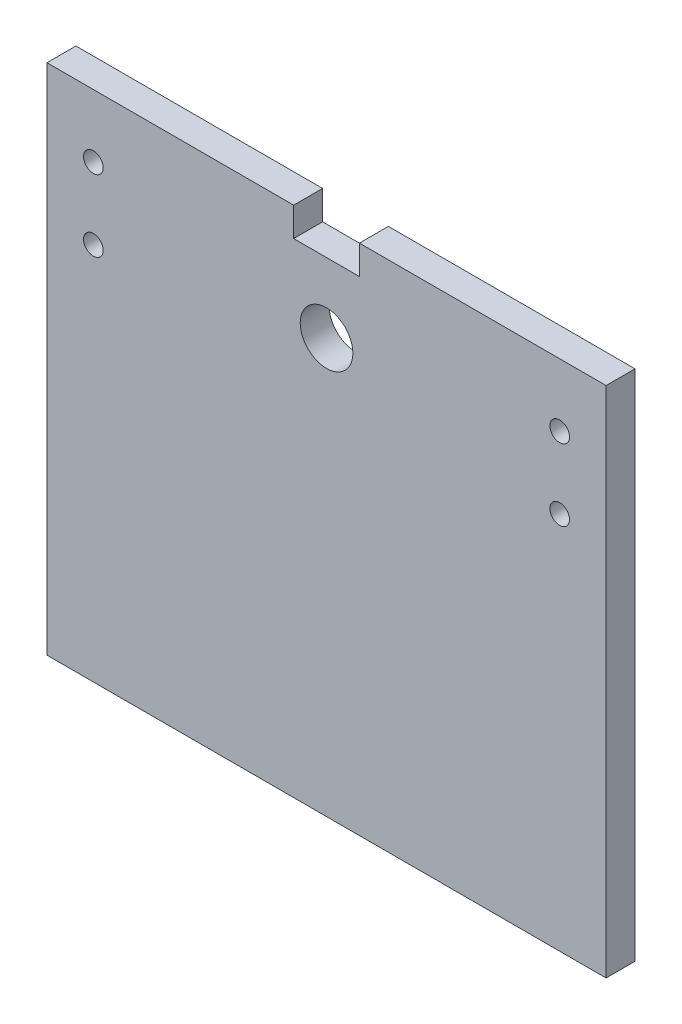
ISO-10303-21;
HEADER;
FILE_DESCRIPTION(('STEP AP214'),'2;1');
FILE_NAME('part.step','',(''),(''),'','','');
FILE_SCHEMA(('AUTOMOTIVE_DESIGN { 1 0 10303 214 1 1 1 1 }'));
ENDSEC;
DATA;
#1=APPLICATION_CONTEXT('core data for automotive mechanical design processes');
#2=APPLICATION_PROTOCOL_DEFINITION('international standard','automotive_design',2000,#1);
#3=PRODUCT_CONTEXT('',#1,'mechanical');
#4=PRODUCT('Part','Part','',(#3));
#5=PRODUCT_RELATED_PRODUCT_CATEGORY('part','',(#4));
#6=PRODUCT_DEFINITION_FORMATION('','',#4);
#7=PRODUCT_DEFINITION_CONTEXT('part definition',#1,'design');
#8=PRODUCT_DEFINITION('design','',#6,#7);
#9=PRODUCT_DEFINITION_SHAPE('','',#8);
#10=(LENGTH_UNIT() NAMED_UNIT(*) SI_UNIT(.MILLI.,.METRE.));
#11=(NAMED_UNIT(*) PLANE_ANGLE_UNIT() SI_UNIT($,.RADIAN.));
#12=(NAMED_UNIT(*) SI_UNIT($,.STERADIAN.) SOLID_ANGLE_UNIT());
#13=UNCERTAINTY_MEASURE_WITH_UNIT(LENGTH_MEASURE(1.E-05),#10,'distance_accuracy_value','');
#14=(GEOMETRIC_REPRESENTATION_CONTEXT(3) GLOBAL_UNCERTAINTY_ASSIGNED_CONTEXT((#13)) GLOBAL_UNIT_ASSIGNED_CONTEXT((#10,
#11,#12)) REPRESENTATION_CONTEXT('',''));
#15=CARTESIAN_POINT('',(0.,0.,0.));
#16=DIRECTION('',(0.,0.,1.));
#17=DIRECTION('',(1.,0.,0.));
#18=AXIS2_PLACEMENT_3D('',#15,#16,#17);
#19=CARTESIAN_POINT('',(6.34999999999999,49.53,2.794));
#20=DIRECTION('',(0.,-1.,0.));
#21=DIRECTION('',(0.,0.,-1.));
#22=AXIS2_PLACEMENT_3D('',#19,#20,#21);
#23=PLANE('',#22);
#24=DIRECTION('',(-1.,0.,0.));
#25=VECTOR('',#24,1.);
#26=CARTESIAN_POINT('',(6.34999999999999,49.53,-2.794));
#27=LINE('',#26,#25);
#28=CARTESIAN_POINT('',(53.975,49.53,-2.794));
#29=VERTEX_POINT('',#28);
#30=CARTESIAN_POINT('',(6.34999999999999,49.53,-2.794));
#31=VERTEX_POINT('',#30);
#32=EDGE_CURVE('E131',#29,#31,#27,.T.);
#33=ORIENTED_EDGE('',*,*,#32,.T.);
#34=DIRECTION('',(0.,0.,-1.));
#35=VECTOR('',#34,1.);
#36=CARTESIAN_POINT('',(6.34999999999999,49.53,2.794));
#37=LINE('',#36,#35);
#38=CARTESIAN_POINT('',(6.34999999999999,49.53,2.794));
#39=VERTEX_POINT('',#38);
#40=EDGE_CURVE('E11',#39,#31,#37,.T.);
#41=ORIENTED_EDGE('',*,*,#40,.F.);
#42=DIRECTION('',(-1.,0.,0.));
#43=VECTOR('',#42,1.);
#44=CARTESIAN_POINT('',(6.34999999999999,49.53,2.794));
#45=LINE('',#44,#43);
#46=CARTESIAN_POINT('',(53.975,49.53,2.794));
#47=VERTEX_POINT('',#46);
#48=EDGE_CURVE('E146',#47,#39,#45,.T.);
#49=ORIENTED_EDGE('',*,*,#48,.F.);
#50=DIRECTION('',(0.,0.,-1.));
#51=VECTOR('',#50,1.);
#52=CARTESIAN_POINT('',(53.975,49.53,2.794));
#53=LINE('',#52,#51);
#54=EDGE_CURVE('E127',#47,#29,#53,.T.);
#55=ORIENTED_EDGE('',*,*,#54,.T.);
#56=EDGE_LOOP('',(#33,#41,#49,#55));
#57=FACE_BOUND('',#56,.T.);
#58=ADVANCED_FACE('F35',(#57),#23,.F.);
#59=CARTESIAN_POINT('',(6.34999999999999,43.942,2.794));
#60=DIRECTION('',(1.,0.,0.));
#61=DIRECTION('',(0.,0.,-1.));
#62=AXIS2_PLACEMENT_3D('',#59,#60,#61);
#63=PLANE('',#62);
#64=DIRECTION('',(0.,-1.,0.));
#65=VECTOR('',#64,1.);
#66=CARTESIAN_POINT('',(6.34999999999999,43.942,-2.794));
#67=LINE('',#66,#65);
#68=CARTESIAN_POINT('',(6.34999999999999,43.942,-2.794));
#69=VERTEX_POINT('',#68);
#70=EDGE_CURVE('E134',#31,#69,#67,.T.);
#71=ORIENTED_EDGE('',*,*,#70,.T.);
#72=DIRECTION('',(0.,0.,-1.));
#73=VECTOR('',#72,1.);
#74=CARTESIAN_POINT('',(6.34999999999999,43.942,2.794));
#75=LINE('',#74,#73);
#76=CARTESIAN_POINT('',(6.34999999999999,43.942,2.794));
#77=VERTEX_POINT('',#76);
#78=EDGE_CURVE('E43',#77,#69,#75,.T.);
#79=ORIENTED_EDGE('',*,*,#78,.F.);
#80=DIRECTION('',(0.,-1.,0.));
#81=VECTOR('',#80,1.);
#82=CARTESIAN_POINT('',(6.34999999999999,43.942,2.794));
#83=LINE('',#82,#81);
#84=EDGE_CURVE('E94',#39,#77,#83,.T.);
#85=ORIENTED_EDGE('',*,*,#84,.F.);
#86=ORIENTED_EDGE('',*,*,#40,.T.);
#87=EDGE_LOOP('',(#71,#79,#85,#86));
#88=FACE_BOUND('',#87,.T.);
#89=ADVANCED_FACE('F236',(#88),#63,.F.);
#90=CARTESIAN_POINT('',(-6.35,43.942,2.794));
#91=DIRECTION('',(0.,-1.,0.));
#92=DIRECTION('',(0.,0.,-1.));
#93=AXIS2_PLACEMENT_3D('',#90,#91,#92);
#94=PLANE('',#93);
#95=DIRECTION('',(-1.,0.,0.));
#96=VECTOR('',#95,1.);
#97=CARTESIAN_POINT('',(-6.35,43.942,-2.794));
#98=LINE('',#97,#96);
#99=CARTESIAN_POINT('',(-6.35,43.942,-2.794));
#100=VERTEX_POINT('',#99);
#101=EDGE_CURVE('E137',#69,#100,#98,.T.);
#102=ORIENTED_EDGE('',*,*,#101,.T.);
#103=DIRECTION('',(0.,0.,-1.));
#104=VECTOR('',#103,1.);
#105=CARTESIAN_POINT('',(-6.35,43.942,2.794));
#106=LINE('',#105,#104);
#107=CARTESIAN_POINT('',(-6.35,43.942,2.794));
#108=VERTEX_POINT('',#107);
#109=EDGE_CURVE('E153',#108,#100,#106,.T.);
#110=ORIENTED_EDGE('',*,*,#109,.F.);
#111=DIRECTION('',(-1.,0.,0.));
#112=VECTOR('',#111,1.);
#113=CARTESIAN_POINT('',(-6.35,43.942,2.794));
#114=LINE('',#113,#112);
#115=EDGE_CURVE('E161',#77,#108,#114,.T.);
#116=ORIENTED_EDGE('',*,*,#115,.F.);
#117=ORIENTED_EDGE('',*,*,#78,.T.);
#118=EDGE_LOOP('',(#102,#110,#116,#117));
#119=FACE_BOUND('',#118,.T.);
#120=ADVANCED_FACE('F159',(#119),#94,.F.);
#121=CARTESIAN_POINT('',(-6.35,49.53,2.794));
#122=DIRECTION('',(-1.,0.,0.));
#123=DIRECTION('',(0.,0.,1.));
#124=AXIS2_PLACEMENT_3D('',#121,#122,#123);
#125=PLANE('',#124);
#126=DIRECTION('',(0.,1.,0.));
#127=VECTOR('',#126,1.);
#128=CARTESIAN_POINT('',(-6.35,49.53,-2.794));
#129=LINE('',#128,#127);
#130=CARTESIAN_POINT('',(-6.35,49.53,-2.794));
#131=VERTEX_POINT('',#130);
#132=EDGE_CURVE('E139',#100,#131,#129,.T.);
#133=ORIENTED_EDGE('',*,*,#132,.T.);
#134=DIRECTION('',(0.,0.,-1.));
#135=VECTOR('',#134,1.);
#136=CARTESIAN_POINT('',(-6.35,49.53,2.794));
#137=LINE('',#136,#135);
#138=CARTESIAN_POINT('',(-6.35,49.53,2.794));
#139=VERTEX_POINT('',#138);
#140=EDGE_CURVE('E150',#139,#131,#137,.T.);
#141=ORIENTED_EDGE('',*,*,#140,.F.);
#142=DIRECTION('',(0.,1.,0.));
#143=VECTOR('',#142,1.);
#144=CARTESIAN_POINT('',(-6.35,49.53,2.794));
#145=LINE('',#144,#143);
#146=EDGE_CURVE('E173',#108,#139,#145,.T.);
#147=ORIENTED_EDGE('',*,*,#146,.F.);
#148=ORIENTED_EDGE('',*,*,#109,.T.);
#149=EDGE_LOOP('',(#133,#141,#147,#148));
#150=FACE_BOUND('',#149,.T.);
#151=ADVANCED_FACE('F169',(#150),#125,.F.);
#152=CARTESIAN_POINT('',(-53.975,49.53,2.794));
#153=DIRECTION('',(0.,-1.,0.));
#154=DIRECTION('',(0.,0.,-1.));
#155=AXIS2_PLACEMENT_3D('',#152,#153,#154);
#156=PLANE('',#155);
#157=DIRECTION('',(-1.,0.,0.));
#158=VECTOR('',#157,1.);
#159=CARTESIAN_POINT('',(-53.975,49.53,-2.794));
#160=LINE('',#159,#158);
#161=CARTESIAN_POINT('',(-53.975,49.53,-2.794));
#162=VERTEX_POINT('',#161);
#163=EDGE_CURVE('E141',#131,#162,#160,.T.);
#164=ORIENTED_EDGE('',*,*,#163,.T.);
#165=DIRECTION('',(0.,0.,-1.));
#166=VECTOR('',#165,1.);
#167=CARTESIAN_POINT('',(-53.975,49.53,2.794));
#168=LINE('',#167,#166);
#169=CARTESIAN_POINT('',(-53.975,49.53,2.794));
#170=VERTEX_POINT('',#169);
#171=EDGE_CURVE('E122',#170,#162,#168,.T.);
#172=ORIENTED_EDGE('',*,*,#171,.F.);
#173=DIRECTION('',(-1.,0.,0.));
#174=VECTOR('',#173,1.);
#175=CARTESIAN_POINT('',(-53.975,49.53,2.794));
#176=LINE('',#175,#174);
#177=EDGE_CURVE('E113',#139,#170,#176,.T.);
#178=ORIENTED_EDGE('',*,*,#177,.F.);
#179=ORIENTED_EDGE('',*,*,#140,.T.);
#180=EDGE_LOOP('',(#164,#172,#178,#179));
#181=FACE_BOUND('',#180,.T.);
#182=ADVANCED_FACE('F172',(#181),#156,.F.);
#183=CARTESIAN_POINT('',(-53.975,-49.53,2.794));
#184=DIRECTION('',(1.,0.,0.));
#185=DIRECTION('',(0.,0.,-1.));
#186=AXIS2_PLACEMENT_3D('',#183,#184,#185);
#187=PLANE('',#186);
#188=DIRECTION('',(0.,-1.,0.));
#189=VECTOR('',#188,1.);
#190=CARTESIAN_POINT('',(-53.975,-49.53,-2.794));
#191=LINE('',#190,#189);
#192=CARTESIAN_POINT('',(-53.975,-49.53,-2.794));
#193=VERTEX_POINT('',#192);
#194=EDGE_CURVE('E121',#162,#193,#191,.T.);
#195=ORIENTED_EDGE('',*,*,#194,.T.);
#196=DIRECTION('',(0.,0.,-1.));
#197=VECTOR('',#196,1.);
#198=CARTESIAN_POINT('',(-53.975,-49.53,2.794));
#199=LINE('',#198,#197);
#200=CARTESIAN_POINT('',(-53.975,-49.53,2.794));
#201=VERTEX_POINT('',#200);
#202=EDGE_CURVE('E118',#201,#193,#199,.T.);
#203=ORIENTED_EDGE('',*,*,#202,.F.);
#204=DIRECTION('',(0.,-1.,0.));
#205=VECTOR('',#204,1.);
#206=CARTESIAN_POINT('',(-53.975,-49.53,2.794));
#207=LINE('',#206,#205);
#208=EDGE_CURVE('E107',#170,#201,#207,.T.);
#209=ORIENTED_EDGE('',*,*,#208,.F.);
#210=ORIENTED_EDGE('',*,*,#171,.T.);
#211=EDGE_LOOP('',(#195,#203,#209,#210));
#212=FACE_BOUND('',#211,.T.);
#213=ADVANCED_FACE('F119',(#212),#187,.F.);
#214=CARTESIAN_POINT('',(-53.975,-49.53,2.794));
#215=DIRECTION('',(0.,1.,0.));
#216=DIRECTION('',(0.,0.,1.));
#217=AXIS2_PLACEMENT_3D('',#214,#215,#216);
#218=PLANE('',#217);
#219=DIRECTION('',(1.,0.,0.));
#220=VECTOR('',#219,1.);
#221=CARTESIAN_POINT('',(-53.975,-49.53,-2.794));
#222=LINE('',#221,#220);
#223=CARTESIAN_POINT('',(53.975,-49.53,-2.794));
#224=VERTEX_POINT('',#223);
#225=EDGE_CURVE('E80',#193,#224,#222,.T.);
#226=ORIENTED_EDGE('',*,*,#225,.T.);
#227=DIRECTION('',(0.,0.,-1.));
#228=VECTOR('',#227,1.);
#229=CARTESIAN_POINT('',(53.975,-49.53,2.794));
#230=LINE('',#229,#228);
#231=CARTESIAN_POINT('',(53.975,-49.53,2.794));
#232=VERTEX_POINT('',#231);
#233=EDGE_CURVE('E123',#232,#224,#230,.T.);
#234=ORIENTED_EDGE('',*,*,#233,.F.);
#235=DIRECTION('',(1.,0.,0.));
#236=VECTOR('',#235,1.);
#237=CARTESIAN_POINT('',(-53.975,-49.53,2.794));
#238=LINE('',#237,#236);
#239=EDGE_CURVE('E111',#201,#232,#238,.T.);
#240=ORIENTED_EDGE('',*,*,#239,.F.);
#241=ORIENTED_EDGE('',*,*,#202,.T.);
#242=EDGE_LOOP('',(#226,#234,#240,#241));
#243=FACE_BOUND('',#242,.T.);
#244=ADVANCED_FACE('F125',(#243),#218,.F.);
#245=CARTESIAN_POINT('',(53.975,-49.53,2.794));
#246=DIRECTION('',(-1.,0.,0.));
#247=DIRECTION('',(0.,0.,1.));
#248=AXIS2_PLACEMENT_3D('',#245,#246,#247);
#249=PLANE('',#248);
#250=DIRECTION('',(0.,1.,0.));
#251=VECTOR('',#250,1.);
#252=CARTESIAN_POINT('',(53.975,-49.53,-2.794));
#253=LINE('',#252,#251);
#254=EDGE_CURVE('E86',#224,#29,#253,.T.);
#255=ORIENTED_EDGE('',*,*,#254,.T.);
#256=ORIENTED_EDGE('',*,*,#54,.F.);
#257=DIRECTION('',(0.,1.,0.));
#258=VECTOR('',#257,1.);
#259=CARTESIAN_POINT('',(53.975,-49.53,2.794));
#260=LINE('',#259,#258);
#261=EDGE_CURVE('E51',#232,#47,#260,.T.);
#262=ORIENTED_EDGE('',*,*,#261,.F.);
#263=ORIENTED_EDGE('',*,*,#233,.T.);
#264=EDGE_LOOP('',(#255,#256,#262,#263));
#265=FACE_BOUND('',#264,.T.);
#266=ADVANCED_FACE('F243',(#265),#249,.F.);
#267=CARTESIAN_POINT('',(0.,0.,2.794));
#268=DIRECTION('',(0.,0.,1.));
#269=DIRECTION('',(1.,0.,0.));
#270=AXIS2_PLACEMENT_3D('',#267,#268,#269);
#271=PLANE('',#270);
#272=CARTESIAN_POINT('',(0.,30.48,2.794));
#273=DIRECTION('',(0.,0.,1.));
#274=DIRECTION('',(1.,0.,0.));
#275=AXIS2_PLACEMENT_3D('',#272,#273,#274);
#276=CIRCLE('',#275,5.08);
#277=CARTESIAN_POINT('',(-5.08,30.48,2.794));
#278=VERTEX_POINT('',#277);
#279=EDGE_CURVE('E203',#278,#278,#276,.F.);
#280=ORIENTED_EDGE('',*,*,#279,.T.);
#281=EDGE_LOOP('',(#280));
#282=FACE_BOUND('',#281,.T.);
#283=CARTESIAN_POINT('',(45.0147972132232,37.3947972132232,2.794));
#284=DIRECTION('',(0.,0.,-1.));
#285=DIRECTION('',(-1.,0.,0.));
#286=AXIS2_PLACEMENT_3D('',#283,#284,#285);
#287=CIRCLE('',#286,1.89865);
#288=CARTESIAN_POINT('',(43.1161472132232,37.3947972132232,2.794));
#289=VERTEX_POINT('',#288);
#290=EDGE_CURVE('E196',#289,#289,#287,.T.);
#291=ORIENTED_EDGE('',*,*,#290,.T.);
#292=EDGE_LOOP('',(#291));
#293=FACE_BOUND('',#292,.T.);
#294=CARTESIAN_POINT('',(45.0147972132232,23.5652027867767,2.794));
#295=DIRECTION('',(0.,0.,-1.));
#296=DIRECTION('',(-1.,0.,0.));
#297=AXIS2_PLACEMENT_3D('',#294,#295,#296);
#298=CIRCLE('',#297,1.89865);
#299=CARTESIAN_POINT('',(43.1161472132232,23.5652027867767,2.794));
#300=VERTEX_POINT('',#299);
#301=EDGE_CURVE('E190',#300,#300,#298,.T.);
#302=ORIENTED_EDGE('',*,*,#301,.T.);
#303=EDGE_LOOP('',(#302));
#304=FACE_BOUND('',#303,.T.);
#305=CARTESIAN_POINT('',(-45.0147972132233,37.3947972132232,2.794));
#306=DIRECTION('',(0.,0.,-1.));
#307=DIRECTION('',(-1.,0.,0.));
#308=AXIS2_PLACEMENT_3D('',#305,#306,#307);
#309=CIRCLE('',#308,1.89865);
#310=CARTESIAN_POINT('',(-46.9134472132233,37.3947972132232,2.794));
#311=VERTEX_POINT('',#310);
#312=EDGE_CURVE('E184',#311,#311,#309,.T.);
#313=ORIENTED_EDGE('',*,*,#312,.T.);
#314=EDGE_LOOP('',(#313));
#315=FACE_BOUND('',#314,.T.);
#316=CARTESIAN_POINT('',(-45.0147972132233,23.5652027867767,2.794));
#317=DIRECTION('',(0.,0.,-1.));
#318=DIRECTION('',(-1.,0.,0.));
#319=AXIS2_PLACEMENT_3D('',#316,#317,#318);
#320=CIRCLE('',#319,1.89865);
#321=CARTESIAN_POINT('',(-46.9134472132233,23.5652027867767,2.794));
#322=VERTEX_POINT('',#321);
#323=EDGE_CURVE('E135',#322,#322,#320,.T.);
#324=ORIENTED_EDGE('',*,*,#323,.T.);
#325=EDGE_LOOP('',(#324));
#326=FACE_BOUND('',#325,.T.);
#327=ORIENTED_EDGE('',*,*,#48,.T.);
#328=ORIENTED_EDGE('',*,*,#84,.T.);
#329=ORIENTED_EDGE('',*,*,#115,.T.);
#330=ORIENTED_EDGE('',*,*,#146,.T.);
#331=ORIENTED_EDGE('',*,*,#177,.T.);
#332=ORIENTED_EDGE('',*,*,#208,.T.);
#333=ORIENTED_EDGE('',*,*,#239,.T.);
#334=ORIENTED_EDGE('',*,*,#261,.T.);
#335=EDGE_LOOP('',(#327,#328,#329,#330,#331,#332,#333,#334));
#336=FACE_BOUND('',#335,.T.);
#337=ADVANCED_FACE('F109',(#282,#293,#304,#315,#326,#336),#271,.T.);
#338=CARTESIAN_POINT('',(0.,0.,-2.794));
#339=DIRECTION('',(0.,0.,1.));
#340=DIRECTION('',(1.,0.,0.));
#341=AXIS2_PLACEMENT_3D('',#338,#339,#340);
#342=PLANE('',#341);
#343=CARTESIAN_POINT('',(0.,30.48,-2.794));
#344=DIRECTION('',(0.,0.,-1.));
#345=DIRECTION('',(-1.,0.,0.));
#346=AXIS2_PLACEMENT_3D('',#343,#344,#345);
#347=CIRCLE('',#346,5.08);
#348=CARTESIAN_POINT('',(-5.08,30.48,-2.794));
#349=VERTEX_POINT('',#348);
#350=EDGE_CURVE('E202',#349,#349,#347,.T.);
#351=ORIENTED_EDGE('',*,*,#350,.F.);
#352=EDGE_LOOP('',(#351));
#353=FACE_BOUND('',#352,.T.);
#354=CARTESIAN_POINT('',(45.0147972132232,37.3947972132232,-2.794));
#355=DIRECTION('',(0.,0.,-1.));
#356=DIRECTION('',(-1.,0.,0.));
#357=AXIS2_PLACEMENT_3D('',#354,#355,#356);
#358=CIRCLE('',#357,1.89865);
#359=CARTESIAN_POINT('',(43.1161472132232,37.3947972132232,-2.794));
#360=VERTEX_POINT('',#359);
#361=EDGE_CURVE('E199',#360,#360,#358,.T.);
#362=ORIENTED_EDGE('',*,*,#361,.F.);
#363=EDGE_LOOP('',(#362));
#364=FACE_BOUND('',#363,.T.);
#365=CARTESIAN_POINT('',(45.0147972132232,23.5652027867767,-2.794));
#366=DIRECTION('',(0.,0.,-1.));
#367=DIRECTION('',(-1.,0.,0.));
#368=AXIS2_PLACEMENT_3D('',#365,#366,#367);
#369=CIRCLE('',#368,1.89865);
#370=CARTESIAN_POINT('',(43.1161472132232,23.5652027867767,-2.794));
#371=VERTEX_POINT('',#370);
#372=EDGE_CURVE('E193',#371,#371,#369,.T.);
#373=ORIENTED_EDGE('',*,*,#372,.F.);
#374=EDGE_LOOP('',(#373));
#375=FACE_BOUND('',#374,.T.);
#376=CARTESIAN_POINT('',(-45.0147972132233,37.3947972132232,-2.794));
#377=DIRECTION('',(0.,0.,-1.));
#378=DIRECTION('',(-1.,0.,0.));
#379=AXIS2_PLACEMENT_3D('',#376,#377,#378);
#380=CIRCLE('',#379,1.89865);
#381=CARTESIAN_POINT('',(-46.9134472132233,37.3947972132232,-2.794));
#382=VERTEX_POINT('',#381);
#383=EDGE_CURVE('E187',#382,#382,#380,.T.);
#384=ORIENTED_EDGE('',*,*,#383,.F.);
#385=EDGE_LOOP('',(#384));
#386=FACE_BOUND('',#385,.T.);
#387=CARTESIAN_POINT('',(-45.0147972132233,23.5652027867767,-2.794));
#388=DIRECTION('',(0.,0.,-1.));
#389=DIRECTION('',(-1.,0.,0.));
#390=AXIS2_PLACEMENT_3D('',#387,#388,#389);
#391=CIRCLE('',#390,1.89865);
#392=CARTESIAN_POINT('',(-46.9134472132233,23.5652027867767,-2.794));
#393=VERTEX_POINT('',#392);
#394=EDGE_CURVE('E181',#393,#393,#391,.T.);
#395=ORIENTED_EDGE('',*,*,#394,.F.);
#396=EDGE_LOOP('',(#395));
#397=FACE_BOUND('',#396,.T.);
#398=ORIENTED_EDGE('',*,*,#32,.F.);
#399=ORIENTED_EDGE('',*,*,#254,.F.);
#400=ORIENTED_EDGE('',*,*,#225,.F.);
#401=ORIENTED_EDGE('',*,*,#194,.F.);
#402=ORIENTED_EDGE('',*,*,#163,.F.);
#403=ORIENTED_EDGE('',*,*,#132,.F.);
#404=ORIENTED_EDGE('',*,*,#101,.F.);
#405=ORIENTED_EDGE('',*,*,#70,.F.);
#406=EDGE_LOOP('',(#398,#399,#400,#401,#402,#403,#404,#405));
#407=FACE_BOUND('',#406,.T.);
#408=ADVANCED_FACE('F165',(#353,#364,#375,#386,#397,#407),#342,.F.);
#409=CARTESIAN_POINT('',(-45.0147972132233,23.5652027867767,-2.794));
#410=DIRECTION('',(0.,0.,-1.));
#411=DIRECTION('',(-1.,0.,0.));
#412=AXIS2_PLACEMENT_3D('',#409,#410,#411);
#413=CYLINDRICAL_SURFACE('',#412,1.89865);
#414=ORIENTED_EDGE('',*,*,#323,.F.);
#415=EDGE_LOOP('',(#414));
#416=FACE_BOUND('',#415,.T.);
#417=ORIENTED_EDGE('',*,*,#394,.T.);
#418=EDGE_LOOP('',(#417));
#419=FACE_BOUND('',#418,.T.);
#420=ADVANCED_FACE('F213',(#416,#419),#413,.F.);
#421=CARTESIAN_POINT('',(-45.0147972132233,37.3947972132232,-2.794));
#422=DIRECTION('',(0.,0.,-1.));
#423=DIRECTION('',(-1.,0.,0.));
#424=AXIS2_PLACEMENT_3D('',#421,#422,#423);
#425=CYLINDRICAL_SURFACE('',#424,1.89865);
#426=ORIENTED_EDGE('',*,*,#312,.F.);
#427=EDGE_LOOP('',(#426));
#428=FACE_BOUND('',#427,.T.);
#429=ORIENTED_EDGE('',*,*,#383,.T.);
#430=EDGE_LOOP('',(#429));
#431=FACE_BOUND('',#430,.T.);
#432=ADVANCED_FACE('F224',(#428,#431),#425,.F.);
#433=CARTESIAN_POINT('',(45.0147972132232,23.5652027867767,-2.794));
#434=DIRECTION('',(0.,0.,-1.));
#435=DIRECTION('',(-1.,0.,0.));
#436=AXIS2_PLACEMENT_3D('',#433,#434,#435);
#437=CYLINDRICAL_SURFACE('',#436,1.89865);
#438=ORIENTED_EDGE('',*,*,#301,.F.);
#439=EDGE_LOOP('',(#438));
#440=FACE_BOUND('',#439,.T.);
#441=ORIENTED_EDGE('',*,*,#372,.T.);
#442=EDGE_LOOP('',(#441));
#443=FACE_BOUND('',#442,.T.);
#444=ADVANCED_FACE('F230',(#440,#443),#437,.F.);
#445=CARTESIAN_POINT('',(45.0147972132232,37.3947972132232,-2.794));
#446=DIRECTION('',(0.,0.,-1.));
#447=DIRECTION('',(-1.,0.,0.));
#448=AXIS2_PLACEMENT_3D('',#445,#446,#447);
#449=CYLINDRICAL_SURFACE('',#448,1.89865);
#450=ORIENTED_EDGE('',*,*,#290,.F.);
#451=EDGE_LOOP('',(#450));
#452=FACE_BOUND('',#451,.T.);
#453=ORIENTED_EDGE('',*,*,#361,.T.);
#454=EDGE_LOOP('',(#453));
#455=FACE_BOUND('',#454,.T.);
#456=ADVANCED_FACE('F305',(#452,#455),#449,.F.);
#457=CARTESIAN_POINT('',(0.,30.48,2.795));
#458=DIRECTION('',(0.,0.,-1.));
#459=DIRECTION('',(-1.,0.,0.));
#460=AXIS2_PLACEMENT_3D('',#457,#458,#459);
#461=CYLINDRICAL_SURFACE('',#460,5.08);
#462=CARTESIAN_POINT('',(-5.08,30.48,2.794));
#463=CARTESIAN_POINT('',(-5.08,30.48,2.73579166666667));
#464=CARTESIAN_POINT('',(-5.08,30.48,2.67758333333333));
#465=CARTESIAN_POINT('',(-5.08,30.48,2.56116666666667));
#466=CARTESIAN_POINT('',(-5.08,30.48,2.50295833333333));
#467=CARTESIAN_POINT('',(-5.08,30.48,2.38654166666667));
#468=CARTESIAN_POINT('',(-5.08,30.48,2.32833333333333));
#469=CARTESIAN_POINT('',(-5.08,30.48,2.21191666666667));
#470=CARTESIAN_POINT('',(-5.08,30.48,2.15370833333333));
#471=CARTESIAN_POINT('',(-5.08,30.48,2.03729166666667));
#472=CARTESIAN_POINT('',(-5.08,30.48,1.97908333333333));
#473=CARTESIAN_POINT('',(-5.08,30.48,1.86266666666667));
#474=CARTESIAN_POINT('',(-5.08,30.48,1.80445833333333));
#475=CARTESIAN_POINT('',(-5.08,30.48,1.68804166666667));
#476=CARTESIAN_POINT('',(-5.08,30.48,1.62983333333333));
#477=CARTESIAN_POINT('',(-5.08,30.48,1.51341666666667));
#478=CARTESIAN_POINT('',(-5.08,30.48,1.45520833333333));
#479=CARTESIAN_POINT('',(-5.08,30.48,1.33879166666667));
#480=CARTESIAN_POINT('',(-5.08,30.48,1.28058333333333));
#481=CARTESIAN_POINT('',(-5.08,30.48,1.16416666666667));
#482=CARTESIAN_POINT('',(-5.08,30.48,1.10595833333333));
#483=CARTESIAN_POINT('',(-5.08,30.48,0.989541666666667));
#484=CARTESIAN_POINT('',(-5.08,30.48,0.931333333333333));
#485=CARTESIAN_POINT('',(-5.08,30.48,0.814916666666667));
#486=CARTESIAN_POINT('',(-5.08,30.48,0.756708333333334));
#487=CARTESIAN_POINT('',(-5.08,30.48,0.640291666666667));
#488=CARTESIAN_POINT('',(-5.08,30.48,0.582083333333333));
#489=CARTESIAN_POINT('',(-5.08,30.48,0.465666666666667));
#490=CARTESIAN_POINT('',(-5.08,30.48,0.407458333333334));
#491=CARTESIAN_POINT('',(-5.08,30.48,0.291041666666667));
#492=CARTESIAN_POINT('',(-5.08,30.48,0.232833333333334));
#493=CARTESIAN_POINT('',(-5.08,30.48,0.116416666666667));
#494=CARTESIAN_POINT('',(-5.08,30.48,0.0582083333333334));
#495=CARTESIAN_POINT('',(-5.08,30.48,-0.0582083333333331));
#496=CARTESIAN_POINT('',(-5.08,30.48,-0.116416666666666));
#497=CARTESIAN_POINT('',(-5.08,30.48,-0.232833333333333));
#498=CARTESIAN_POINT('',(-5.08,30.48,-0.291041666666666));
#499=CARTESIAN_POINT('',(-5.08,30.48,-0.407458333333333));
#500=CARTESIAN_POINT('',(-5.08,30.48,-0.465666666666667));
#501=CARTESIAN_POINT('',(-5.08,30.48,-0.582083333333333));
#502=CARTESIAN_POINT('',(-5.08,30.48,-0.640291666666666));
#503=CARTESIAN_POINT('',(-5.08,30.48,-0.756708333333333));
#504=CARTESIAN_POINT('',(-5.08,30.48,-0.814916666666666));
#505=CARTESIAN_POINT('',(-5.08,30.48,-0.931333333333333));
#506=CARTESIAN_POINT('',(-5.08,30.48,-0.989541666666667));
#507=CARTESIAN_POINT('',(-5.08,30.48,-1.10595833333333));
#508=CARTESIAN_POINT('',(-5.08,30.48,-1.16416666666667));
#509=CARTESIAN_POINT('',(-5.08,30.48,-1.28058333333333));
#510=CARTESIAN_POINT('',(-5.08,30.48,-1.33879166666667));
#511=CARTESIAN_POINT('',(-5.08,30.48,-1.45520833333333));
#512=CARTESIAN_POINT('',(-5.08,30.48,-1.51341666666667));
#513=CARTESIAN_POINT('',(-5.08,30.48,-1.62983333333333));
#514=CARTESIAN_POINT('',(-5.08,30.48,-1.68804166666667));
#515=CARTESIAN_POINT('',(-5.08,30.48,-1.80445833333333));
#516=CARTESIAN_POINT('',(-5.08,30.48,-1.86266666666667));
#517=CARTESIAN_POINT('',(-5.08,30.48,-1.97908333333333));
#518=CARTESIAN_POINT('',(-5.08,30.48,-2.03729166666667));
#519=CARTESIAN_POINT('',(-5.08,30.48,-2.15370833333333));
#520=CARTESIAN_POINT('',(-5.08,30.48,-2.21191666666667));
#521=CARTESIAN_POINT('',(-5.08,30.48,-2.32833333333333));
#522=CARTESIAN_POINT('',(-5.08,30.48,-2.38654166666667));
#523=CARTESIAN_POINT('',(-5.08,30.48,-2.50295833333333));
#524=CARTESIAN_POINT('',(-5.08,30.48,-2.56116666666667));
#525=CARTESIAN_POINT('',(-5.08,30.48,-2.67758333333333));
#526=CARTESIAN_POINT('',(-5.08,30.48,-2.73579166666667));
#527=CARTESIAN_POINT('',(-5.08,30.48,-2.794));
#528=B_SPLINE_CURVE_WITH_KNOTS('',3,(#462,#463,#464,#465,#466,#467,#468,#469,#470,#471,#472,
#473,#474,#475,#476,#477,#478,#479,#480,#481,#482,#483,#484,#485,#486,#487,#488,#489,#490,#491,
#492,#493,#494,#495,#496,#497,#498,#499,#500,#501,#502,#503,#504,#505,#506,#507,#508,#509,#510,
#511,#512,#513,#514,#515,#516,#517,#518,#519,#520,#521,#522,#523,#524,#525,#526,#527),
.UNSPECIFIED.,.F.,.F.,(4,2,2,2,2,2,2,2,2,2,2,2,2,2,2,2,2,2,2,2,2,2,2,2,2,2,2,2,2,2,2,2,4),(0.,
0.174625,0.34925,0.523875,0.6985,0.873125,1.04775,1.222375,1.397,1.571625,1.74625,1.920875,
2.0955,2.270125,2.44475,2.619375,2.794,2.968625,3.14325,3.317875,3.4925,3.667125,3.84175,
4.016375,4.191,4.365625,4.54025,4.714875,4.8895,5.064125,5.23875,5.413375,5.588),.UNSPECIFIED.);
#529=EDGE_CURVE('BSEAM209',#278,#349,#528,.T.);
#530=ORIENTED_EDGE('',*,*,#279,.F.);
#531=ORIENTED_EDGE('',*,*,#350,.T.);
#532=ORIENTED_EDGE('',*,*,#529,.T.);
#533=ORIENTED_EDGE('',*,*,#529,.F.);
#534=EDGE_LOOP('',(#530,#532,#531,#533));
#535=FACE_BOUND('',#534,.T.);
#536=ADVANCED_FACE('F209',(#535),#461,.F.);
#537=CLOSED_SHELL('',(#58,#89,#120,#151,#182,#213,#244,#266,#337,#408,#420,#432,#444,#456,#536));
#538=MANIFOLD_SOLID_BREP('B2',#537);
#539=ADVANCED_BREP_SHAPE_REPRESENTATION('',(#18,#538),#14);
#540=SHAPE_DEFINITION_REPRESENTATION(#9,#539);
ENDSEC;
END-ISO-10303-21;
